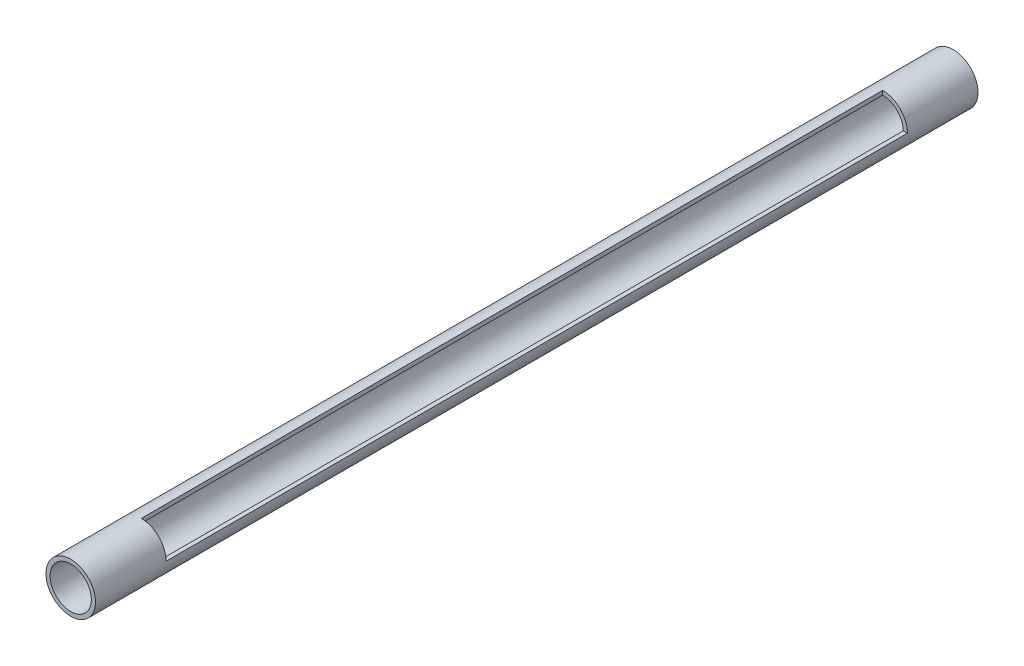
ISO-10303-21;
HEADER;
FILE_DESCRIPTION(('STEP AP214'),'2;1');
FILE_NAME('part.step','',(''),(''),'','','');
FILE_SCHEMA(('AUTOMOTIVE_DESIGN { 1 0 10303 214 1 1 1 1 }'));
ENDSEC;
DATA;
#1=APPLICATION_CONTEXT('core data for automotive mechanical design processes');
#2=APPLICATION_PROTOCOL_DEFINITION('international standard','automotive_design',2000,#1);
#3=PRODUCT_CONTEXT('',#1,'mechanical');
#4=PRODUCT('Part','Part','',(#3));
#5=PRODUCT_RELATED_PRODUCT_CATEGORY('part','',(#4));
#6=PRODUCT_DEFINITION_FORMATION('','',#4);
#7=PRODUCT_DEFINITION_CONTEXT('part definition',#1,'design');
#8=PRODUCT_DEFINITION('design','',#6,#7);
#9=PRODUCT_DEFINITION_SHAPE('','',#8);
#10=(LENGTH_UNIT() NAMED_UNIT(*) SI_UNIT(.MILLI.,.METRE.));
#11=(NAMED_UNIT(*) PLANE_ANGLE_UNIT() SI_UNIT($,.RADIAN.));
#12=(NAMED_UNIT(*) SI_UNIT($,.STERADIAN.) SOLID_ANGLE_UNIT());
#13=UNCERTAINTY_MEASURE_WITH_UNIT(LENGTH_MEASURE(1.E-05),#10,'distance_accuracy_value','');
#14=(GEOMETRIC_REPRESENTATION_CONTEXT(3) GLOBAL_UNCERTAINTY_ASSIGNED_CONTEXT((#13)) GLOBAL_UNIT_ASSIGNED_CONTEXT((#10,
#11,#12)) REPRESENTATION_CONTEXT('',''));
#15=CARTESIAN_POINT('',(0.,0.,0.));
#16=DIRECTION('',(0.,0.,1.));
#17=DIRECTION('',(1.,0.,0.));
#18=AXIS2_PLACEMENT_3D('',#15,#16,#17);
#19=CARTESIAN_POINT('',(0.,0.,375.));
#20=DIRECTION('',(0.,0.,1.));
#21=DIRECTION('',(1.,0.,0.));
#22=AXIS2_PLACEMENT_3D('',#19,#20,#21);
#23=PLANE('',#22);
#24=CARTESIAN_POINT('',(0.,0.,375.));
#25=DIRECTION('',(0.,0.,1.));
#26=DIRECTION('',(1.,0.,0.));
#27=AXIS2_PLACEMENT_3D('',#24,#25,#26);
#28=CIRCLE('',#27,21.035);
#29=CARTESIAN_POINT('',(21.035,0.,375.));
#30=VERTEX_POINT('',#29);
#31=EDGE_CURVE('E113',#30,#30,#28,.T.);
#32=ORIENTED_EDGE('',*,*,#31,.T.);
#33=EDGE_LOOP('',(#32));
#34=FACE_BOUND('',#33,.T.);
#35=CARTESIAN_POINT('',(0.,0.,375.));
#36=DIRECTION('',(0.,0.,1.));
#37=DIRECTION('',(1.,0.,0.));
#38=AXIS2_PLACEMENT_3D('',#35,#36,#37);
#39=CIRCLE('',#38,17.525);
#40=CARTESIAN_POINT('',(17.525,0.,375.));
#41=VERTEX_POINT('',#40);
#42=EDGE_CURVE('E107',#41,#41,#39,.T.);
#43=ORIENTED_EDGE('',*,*,#42,.F.);
#44=EDGE_LOOP('',(#43));
#45=FACE_BOUND('',#44,.T.);
#46=ADVANCED_FACE('F41',(#34,#45),#23,.T.);
#47=CARTESIAN_POINT('',(0.,0.,-375.));
#48=DIRECTION('',(0.,0.,1.));
#49=DIRECTION('',(1.,0.,0.));
#50=AXIS2_PLACEMENT_3D('',#47,#48,#49);
#51=PLANE('',#50);
#52=CARTESIAN_POINT('',(0.,0.,-375.));
#53=DIRECTION('',(0.,0.,1.));
#54=DIRECTION('',(1.,0.,0.));
#55=AXIS2_PLACEMENT_3D('',#52,#53,#54);
#56=CIRCLE('',#55,21.035);
#57=CARTESIAN_POINT('',(21.035,0.,-375.));
#58=VERTEX_POINT('',#57);
#59=EDGE_CURVE('E110',#58,#58,#56,.T.);
#60=ORIENTED_EDGE('',*,*,#59,.F.);
#61=EDGE_LOOP('',(#60));
#62=FACE_BOUND('',#61,.T.);
#63=CARTESIAN_POINT('',(0.,0.,-375.));
#64=DIRECTION('',(0.,0.,1.));
#65=DIRECTION('',(1.,0.,0.));
#66=AXIS2_PLACEMENT_3D('',#63,#64,#65);
#67=CIRCLE('',#66,17.525);
#68=CARTESIAN_POINT('',(17.525,0.,-375.));
#69=VERTEX_POINT('',#68);
#70=EDGE_CURVE('E103',#69,#69,#67,.T.);
#71=ORIENTED_EDGE('',*,*,#70,.T.);
#72=EDGE_LOOP('',(#71));
#73=FACE_BOUND('',#72,.T.);
#74=ADVANCED_FACE('F140',(#62,#73),#51,.F.);
#75=CARTESIAN_POINT('',(0.,0.,375.));
#76=DIRECTION('',(0.,0.,-1.));
#77=DIRECTION('',(-1.,0.,0.));
#78=AXIS2_PLACEMENT_3D('',#75,#76,#77);
#79=CYLINDRICAL_SURFACE('',#78,21.035);
#80=DIRECTION('',(0.,0.,1.));
#81=VECTOR('',#80,1.);
#82=CARTESIAN_POINT('',(0.,21.035,-315.));
#83=LINE('',#82,#81);
#84=CARTESIAN_POINT('',(0.,21.035,-315.));
#85=VERTEX_POINT('',#84);
#86=CARTESIAN_POINT('',(0.,21.035,315.));
#87=VERTEX_POINT('',#86);
#88=EDGE_CURVE('E81',#85,#87,#83,.T.);
#89=ORIENTED_EDGE('',*,*,#88,.F.);
#90=CARTESIAN_POINT('',(0.,0.,-315.));
#91=DIRECTION('',(0.,0.,-1.));
#92=DIRECTION('',(-1.,0.,0.));
#93=AXIS2_PLACEMENT_3D('',#90,#91,#92);
#94=CIRCLE('',#93,21.035);
#95=CARTESIAN_POINT('',(21.035,0.,-315.));
#96=VERTEX_POINT('',#95);
#97=EDGE_CURVE('E101',#85,#96,#94,.T.);
#98=ORIENTED_EDGE('',*,*,#97,.T.);
#99=DIRECTION('',(0.,0.,-1.));
#100=VECTOR('',#99,1.);
#101=CARTESIAN_POINT('',(21.035,0.,375.));
#102=LINE('',#101,#100);
#103=CARTESIAN_POINT('',(21.035,0.,315.));
#104=VERTEX_POINT('',#103);
#105=EDGE_CURVE('E100',#96,#104,#102,.F.);
#106=ORIENTED_EDGE('',*,*,#105,.T.);
#107=CARTESIAN_POINT('',(0.,0.,315.));
#108=DIRECTION('',(0.,0.,-1.));
#109=DIRECTION('',(-1.,0.,0.));
#110=AXIS2_PLACEMENT_3D('',#107,#108,#109);
#111=CIRCLE('',#110,21.035);
#112=EDGE_CURVE('E94',#87,#104,#111,.T.);
#113=ORIENTED_EDGE('',*,*,#112,.F.);
#114=EDGE_LOOP('',(#89,#98,#106,#113));
#115=FACE_BOUND('',#114,.T.);
#116=ORIENTED_EDGE('',*,*,#31,.F.);
#117=EDGE_LOOP('',(#116));
#118=FACE_BOUND('',#117,.T.);
#119=ORIENTED_EDGE('',*,*,#59,.T.);
#120=EDGE_LOOP('',(#119));
#121=FACE_BOUND('',#120,.T.);
#122=ADVANCED_FACE('F43',(#115,#118,#121),#79,.T.);
#123=CARTESIAN_POINT('',(0.,0.,375.));
#124=DIRECTION('',(0.,0.,-1.));
#125=DIRECTION('',(-1.,0.,0.));
#126=AXIS2_PLACEMENT_3D('',#123,#124,#125);
#127=CYLINDRICAL_SURFACE('',#126,17.525);
#128=CARTESIAN_POINT('',(0.,0.,-315.));
#129=DIRECTION('',(0.,0.,-1.));
#130=DIRECTION('',(-1.,0.,0.));
#131=AXIS2_PLACEMENT_3D('',#128,#129,#130);
#132=CIRCLE('',#131,17.525);
#133=CARTESIAN_POINT('',(0.,17.525,-315.));
#134=VERTEX_POINT('',#133);
#135=CARTESIAN_POINT('',(17.525,0.,-315.));
#136=VERTEX_POINT('',#135);
#137=EDGE_CURVE('E11',#134,#136,#132,.T.);
#138=ORIENTED_EDGE('',*,*,#137,.F.);
#139=DIRECTION('',(0.,0.,-1.));
#140=VECTOR('',#139,1.);
#141=CARTESIAN_POINT('',(0.,17.525,375.));
#142=LINE('',#141,#140);
#143=CARTESIAN_POINT('',(0.,17.525,315.));
#144=VERTEX_POINT('',#143);
#145=EDGE_CURVE('E49',#134,#144,#142,.F.);
#146=ORIENTED_EDGE('',*,*,#145,.T.);
#147=CARTESIAN_POINT('',(0.,0.,315.));
#148=DIRECTION('',(0.,0.,-1.));
#149=DIRECTION('',(-1.,0.,0.));
#150=AXIS2_PLACEMENT_3D('',#147,#148,#149);
#151=CIRCLE('',#150,17.525);
#152=CARTESIAN_POINT('',(17.525,0.,315.));
#153=VERTEX_POINT('',#152);
#154=EDGE_CURVE('E97',#144,#153,#151,.T.);
#155=ORIENTED_EDGE('',*,*,#154,.T.);
#156=DIRECTION('',(0.,0.,-1.));
#157=VECTOR('',#156,1.);
#158=CARTESIAN_POINT('',(17.525,0.,375.));
#159=LINE('',#158,#157);
#160=EDGE_CURVE('E116',#136,#153,#159,.F.);
#161=ORIENTED_EDGE('',*,*,#160,.F.);
#162=EDGE_LOOP('',(#138,#146,#155,#161));
#163=FACE_BOUND('',#162,.T.);
#164=ORIENTED_EDGE('',*,*,#42,.T.);
#165=EDGE_LOOP('',(#164));
#166=FACE_BOUND('',#165,.T.);
#167=ORIENTED_EDGE('',*,*,#70,.F.);
#168=EDGE_LOOP('',(#167));
#169=FACE_BOUND('',#168,.T.);
#170=ADVANCED_FACE('F122',(#163,#166,#169),#127,.F.);
#171=CARTESIAN_POINT('',(0.,21.035,-315.));
#172=DIRECTION('',(0.,0.,-1.));
#173=DIRECTION('',(-1.,0.,0.));
#174=AXIS2_PLACEMENT_3D('',#171,#172,#173);
#175=PLANE('',#174);
#176=DIRECTION('',(0.,-1.,0.));
#177=VECTOR('',#176,1.);
#178=CARTESIAN_POINT('',(0.,21.035,-315.));
#179=LINE('',#178,#177);
#180=EDGE_CURVE('E87',#85,#134,#179,.T.);
#181=ORIENTED_EDGE('',*,*,#180,.T.);
#182=ORIENTED_EDGE('',*,*,#137,.T.);
#183=DIRECTION('',(1.,0.,0.));
#184=VECTOR('',#183,1.);
#185=CARTESIAN_POINT('',(0.,0.,-315.));
#186=LINE('',#185,#184);
#187=EDGE_CURVE('E61',#136,#96,#186,.T.);
#188=ORIENTED_EDGE('',*,*,#187,.T.);
#189=ORIENTED_EDGE('',*,*,#97,.F.);
#190=EDGE_LOOP('',(#181,#182,#188,#189));
#191=FACE_BOUND('',#190,.T.);
#192=ADVANCED_FACE('F126',(#191),#175,.F.);
#193=CARTESIAN_POINT('',(0.,21.035,315.));
#194=DIRECTION('',(0.,0.,-1.));
#195=DIRECTION('',(-1.,0.,0.));
#196=AXIS2_PLACEMENT_3D('',#193,#194,#195);
#197=PLANE('',#196);
#198=ORIENTED_EDGE('',*,*,#112,.T.);
#199=DIRECTION('',(1.,0.,0.));
#200=VECTOR('',#199,1.);
#201=CARTESIAN_POINT('',(0.,0.,315.));
#202=LINE('',#201,#200);
#203=EDGE_CURVE('E56',#153,#104,#202,.T.);
#204=ORIENTED_EDGE('',*,*,#203,.F.);
#205=ORIENTED_EDGE('',*,*,#154,.F.);
#206=DIRECTION('',(0.,-1.,0.));
#207=VECTOR('',#206,1.);
#208=CARTESIAN_POINT('',(0.,21.035,315.));
#209=LINE('',#208,#207);
#210=EDGE_CURVE('E84',#87,#144,#209,.T.);
#211=ORIENTED_EDGE('',*,*,#210,.F.);
#212=EDGE_LOOP('',(#198,#204,#205,#211));
#213=FACE_BOUND('',#212,.T.);
#214=ADVANCED_FACE('F93',(#213),#197,.T.);
#215=CARTESIAN_POINT('',(0.,0.,0.));
#216=DIRECTION('',(0.,-1.,0.));
#217=DIRECTION('',(0.,0.,-1.));
#218=AXIS2_PLACEMENT_3D('',#215,#216,#217);
#219=PLANE('',#218);
#220=ORIENTED_EDGE('',*,*,#187,.F.);
#221=ORIENTED_EDGE('',*,*,#160,.T.);
#222=ORIENTED_EDGE('',*,*,#203,.T.);
#223=ORIENTED_EDGE('',*,*,#105,.F.);
#224=EDGE_LOOP('',(#220,#221,#222,#223));
#225=FACE_BOUND('',#224,.T.);
#226=ADVANCED_FACE('F130',(#225),#219,.F.);
#227=CARTESIAN_POINT('',(0.,21.035,-315.));
#228=DIRECTION('',(1.,0.,0.));
#229=DIRECTION('',(0.,0.,-1.));
#230=AXIS2_PLACEMENT_3D('',#227,#228,#229);
#231=PLANE('',#230);
#232=ORIENTED_EDGE('',*,*,#180,.F.);
#233=ORIENTED_EDGE('',*,*,#88,.T.);
#234=ORIENTED_EDGE('',*,*,#210,.T.);
#235=ORIENTED_EDGE('',*,*,#145,.F.);
#236=EDGE_LOOP('',(#232,#233,#234,#235));
#237=FACE_BOUND('',#236,.T.);
#238=ADVANCED_FACE('F83',(#237),#231,.T.);
#239=CLOSED_SHELL('',(#46,#74,#122,#170,#192,#214,#226,#238));
#240=MANIFOLD_SOLID_BREP('B2',#239);
#241=ADVANCED_BREP_SHAPE_REPRESENTATION('',(#18,#240),#14);
#242=SHAPE_DEFINITION_REPRESENTATION(#9,#241);
ENDSEC;
END-ISO-10303-21;
